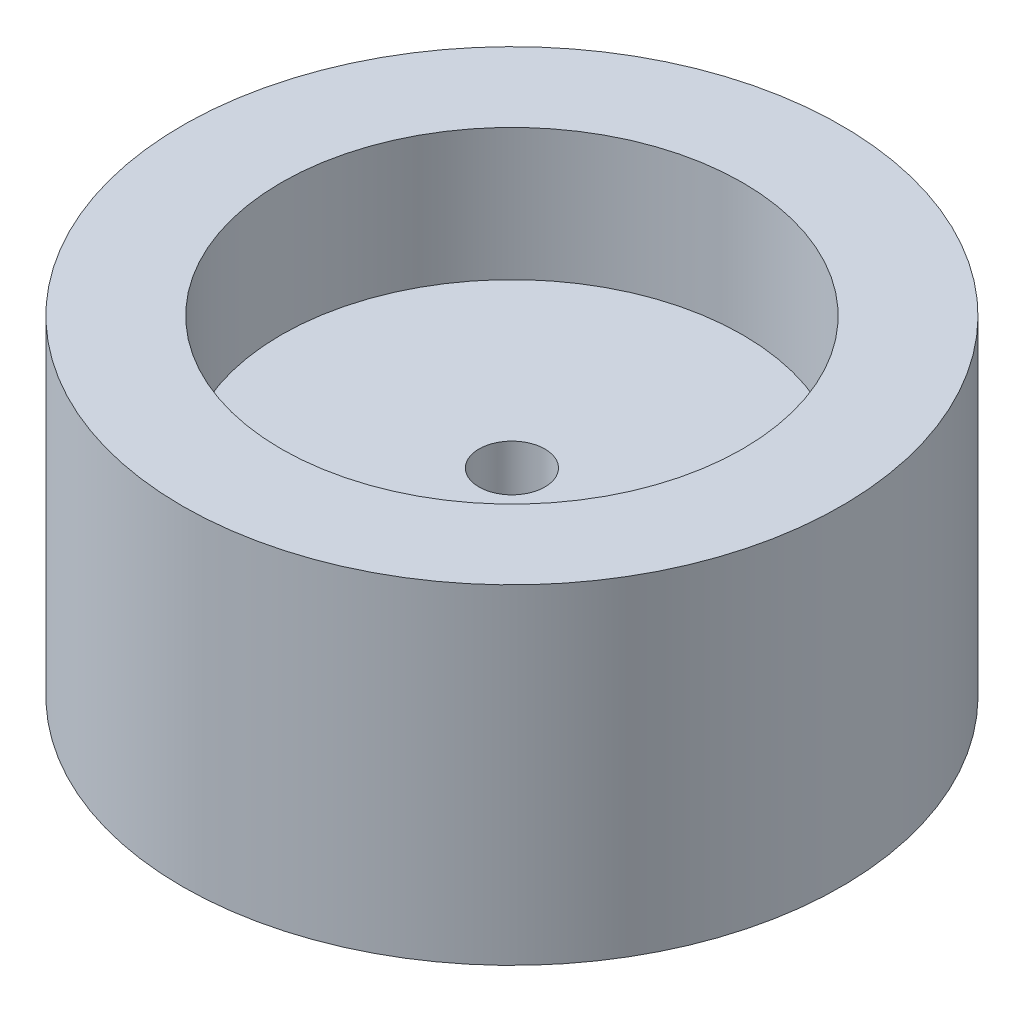
ISO-10303-21;
HEADER;
FILE_DESCRIPTION(('STEP AP214'),'2;1');
FILE_NAME('part.step','',(''),(''),'','','');
FILE_SCHEMA(('AUTOMOTIVE_DESIGN { 1 0 10303 214 1 1 1 1 }'));
ENDSEC;
DATA;
#1=APPLICATION_CONTEXT('core data for automotive mechanical design processes');
#2=APPLICATION_PROTOCOL_DEFINITION('international standard','automotive_design',2000,#1);
#3=PRODUCT_CONTEXT('',#1,'mechanical');
#4=PRODUCT('Part','Part','',(#3));
#5=PRODUCT_RELATED_PRODUCT_CATEGORY('part','',(#4));
#6=PRODUCT_DEFINITION_FORMATION('','',#4);
#7=PRODUCT_DEFINITION_CONTEXT('part definition',#1,'design');
#8=PRODUCT_DEFINITION('design','',#6,#7);
#9=PRODUCT_DEFINITION_SHAPE('','',#8);
#10=(LENGTH_UNIT() NAMED_UNIT(*) SI_UNIT(.MILLI.,.METRE.));
#11=(NAMED_UNIT(*) PLANE_ANGLE_UNIT() SI_UNIT($,.RADIAN.));
#12=(NAMED_UNIT(*) SI_UNIT($,.STERADIAN.) SOLID_ANGLE_UNIT());
#13=UNCERTAINTY_MEASURE_WITH_UNIT(LENGTH_MEASURE(1.E-05),#10,'distance_accuracy_value','');
#14=(GEOMETRIC_REPRESENTATION_CONTEXT(3) GLOBAL_UNCERTAINTY_ASSIGNED_CONTEXT((#13)) GLOBAL_UNIT_ASSIGNED_CONTEXT((#10,
#11,#12)) REPRESENTATION_CONTEXT('',''));
#15=CARTESIAN_POINT('',(0.,0.,0.));
#16=DIRECTION('',(0.,0.,1.));
#17=DIRECTION('',(1.,0.,0.));
#18=AXIS2_PLACEMENT_3D('',#15,#16,#17);
#19=CARTESIAN_POINT('',(0.,25.,0.));
#20=DIRECTION('',(0.,-1.,0.));
#21=DIRECTION('',(0.,0.,-1.));
#22=AXIS2_PLACEMENT_3D('',#19,#20,#21);
#23=CYLINDRICAL_SURFACE('',#22,25.);
#24=CARTESIAN_POINT('',(0.,25.,0.));
#25=DIRECTION('',(0.,1.,0.));
#26=DIRECTION('',(0.,0.,1.));
#27=AXIS2_PLACEMENT_3D('',#24,#25,#26);
#28=CIRCLE('',#27,25.);
#29=CARTESIAN_POINT('',(0.,25.,25.));
#30=VERTEX_POINT('',#29);
#31=EDGE_CURVE('E10',#30,#30,#28,.T.);
#32=ORIENTED_EDGE('',*,*,#31,.F.);
#33=EDGE_LOOP('',(#32));
#34=FACE_BOUND('',#33,.T.);
#35=CARTESIAN_POINT('',(0.,0.,0.));
#36=DIRECTION('',(0.,1.,0.));
#37=DIRECTION('',(0.,0.,1.));
#38=AXIS2_PLACEMENT_3D('',#35,#36,#37);
#39=CIRCLE('',#38,25.);
#40=CARTESIAN_POINT('',(0.,0.,25.));
#41=VERTEX_POINT('',#40);
#42=EDGE_CURVE('E46',#41,#41,#39,.T.);
#43=ORIENTED_EDGE('',*,*,#42,.T.);
#44=EDGE_LOOP('',(#43));
#45=FACE_BOUND('',#44,.T.);
#46=ADVANCED_FACE('F39',(#34,#45),#23,.T.);
#47=CARTESIAN_POINT('',(0.,25.,0.));
#48=DIRECTION('',(0.,1.,0.));
#49=DIRECTION('',(0.,0.,1.));
#50=AXIS2_PLACEMENT_3D('',#47,#48,#49);
#51=PLANE('',#50);
#52=CARTESIAN_POINT('',(0.,25.,0.));
#53=DIRECTION('',(0.,-1.,0.));
#54=DIRECTION('',(0.,0.,-1.));
#55=AXIS2_PLACEMENT_3D('',#52,#53,#54);
#56=CIRCLE('',#55,17.5);
#57=CARTESIAN_POINT('',(0.,25.,-17.5));
#58=VERTEX_POINT('',#57);
#59=EDGE_CURVE('E59',#58,#58,#56,.T.);
#60=ORIENTED_EDGE('',*,*,#59,.T.);
#61=EDGE_LOOP('',(#60));
#62=FACE_BOUND('',#61,.T.);
#63=ORIENTED_EDGE('',*,*,#31,.T.);
#64=EDGE_LOOP('',(#63));
#65=FACE_BOUND('',#64,.T.);
#66=ADVANCED_FACE('F86',(#62,#65),#51,.T.);
#67=CARTESIAN_POINT('',(0.,0.,0.));
#68=DIRECTION('',(0.,1.,0.));
#69=DIRECTION('',(0.,0.,1.));
#70=AXIS2_PLACEMENT_3D('',#67,#68,#69);
#71=PLANE('',#70);
#72=CARTESIAN_POINT('',(0.,0.,0.));
#73=DIRECTION('',(0.,-1.,0.));
#74=DIRECTION('',(0.,0.,-1.));
#75=AXIS2_PLACEMENT_3D('',#72,#73,#74);
#76=CIRCLE('',#75,17.5);
#77=CARTESIAN_POINT('',(0.,0.,-17.5));
#78=VERTEX_POINT('',#77);
#79=EDGE_CURVE('E53',#78,#78,#76,.T.);
#80=ORIENTED_EDGE('',*,*,#79,.F.);
#81=EDGE_LOOP('',(#80));
#82=FACE_BOUND('',#81,.T.);
#83=ORIENTED_EDGE('',*,*,#42,.F.);
#84=EDGE_LOOP('',(#83));
#85=FACE_BOUND('',#84,.T.);
#86=ADVANCED_FACE('F88',(#82,#85),#71,.F.);
#87=CARTESIAN_POINT('',(0.,10.,0.));
#88=DIRECTION('',(0.,-1.,0.));
#89=DIRECTION('',(0.,0.,-1.));
#90=AXIS2_PLACEMENT_3D('',#87,#88,#89);
#91=CYLINDRICAL_SURFACE('',#90,17.5);
#92=CARTESIAN_POINT('',(0.,10.,0.));
#93=DIRECTION('',(0.,-1.,0.));
#94=DIRECTION('',(0.,0.,-1.));
#95=AXIS2_PLACEMENT_3D('',#92,#93,#94);
#96=CIRCLE('',#95,17.5);
#97=CARTESIAN_POINT('',(0.,10.,-17.5));
#98=VERTEX_POINT('',#97);
#99=EDGE_CURVE('E51',#98,#98,#96,.T.);
#100=ORIENTED_EDGE('',*,*,#99,.F.);
#101=EDGE_LOOP('',(#100));
#102=FACE_BOUND('',#101,.T.);
#103=ORIENTED_EDGE('',*,*,#79,.T.);
#104=EDGE_LOOP('',(#103));
#105=FACE_BOUND('',#104,.T.);
#106=ADVANCED_FACE('F94',(#102,#105),#91,.F.);
#107=CARTESIAN_POINT('',(0.,10.,0.));
#108=DIRECTION('',(0.,-1.,0.));
#109=DIRECTION('',(0.,0.,-1.));
#110=AXIS2_PLACEMENT_3D('',#107,#108,#109);
#111=PLANE('',#110);
#112=CARTESIAN_POINT('',(0.,10.,0.));
#113=DIRECTION('',(0.,-1.,0.));
#114=DIRECTION('',(0.,0.,-1.));
#115=AXIS2_PLACEMENT_3D('',#112,#113,#114);
#116=CIRCLE('',#115,2.5);
#117=CARTESIAN_POINT('',(0.,10.,-2.5));
#118=VERTEX_POINT('',#117);
#119=EDGE_CURVE('E64',#118,#118,#116,.T.);
#120=ORIENTED_EDGE('',*,*,#119,.F.);
#121=EDGE_LOOP('',(#120));
#122=FACE_BOUND('',#121,.T.);
#123=ORIENTED_EDGE('',*,*,#99,.T.);
#124=EDGE_LOOP('',(#123));
#125=FACE_BOUND('',#124,.T.);
#126=ADVANCED_FACE('F82',(#122,#125),#111,.T.);
#127=CARTESIAN_POINT('',(0.,15.,0.));
#128=DIRECTION('',(0.,1.,0.));
#129=DIRECTION('',(0.,0.,1.));
#130=AXIS2_PLACEMENT_3D('',#127,#128,#129);
#131=CYLINDRICAL_SURFACE('',#130,17.5);
#132=CARTESIAN_POINT('',(0.,15.,0.));
#133=DIRECTION('',(0.,-1.,0.));
#134=DIRECTION('',(0.,0.,-1.));
#135=AXIS2_PLACEMENT_3D('',#132,#133,#134);
#136=CIRCLE('',#135,17.5);
#137=CARTESIAN_POINT('',(0.,15.,-17.5));
#138=VERTEX_POINT('',#137);
#139=EDGE_CURVE('E56',#138,#138,#136,.T.);
#140=ORIENTED_EDGE('',*,*,#139,.T.);
#141=EDGE_LOOP('',(#140));
#142=FACE_BOUND('',#141,.T.);
#143=ORIENTED_EDGE('',*,*,#59,.F.);
#144=EDGE_LOOP('',(#143));
#145=FACE_BOUND('',#144,.T.);
#146=ADVANCED_FACE('F76',(#142,#145),#131,.F.);
#147=CARTESIAN_POINT('',(0.,15.,0.));
#148=DIRECTION('',(0.,1.,0.));
#149=DIRECTION('',(0.,0.,-1.));
#150=AXIS2_PLACEMENT_3D('',#147,#148,#149);
#151=PLANE('',#150);
#152=CARTESIAN_POINT('',(0.,15.,0.));
#153=DIRECTION('',(0.,1.,0.));
#154=DIRECTION('',(0.,0.,1.));
#155=AXIS2_PLACEMENT_3D('',#152,#153,#154);
#156=CIRCLE('',#155,2.5);
#157=CARTESIAN_POINT('',(0.,15.,-2.5));
#158=VERTEX_POINT('',#157);
#159=EDGE_CURVE('E42',#158,#158,#156,.T.);
#160=ORIENTED_EDGE('',*,*,#159,.F.);
#161=EDGE_LOOP('',(#160));
#162=FACE_BOUND('',#161,.T.);
#163=ORIENTED_EDGE('',*,*,#139,.F.);
#164=EDGE_LOOP('',(#163));
#165=FACE_BOUND('',#164,.T.);
#166=ADVANCED_FACE('F73',(#162,#165),#151,.T.);
#167=CARTESIAN_POINT('',(0.,25.,0.));
#168=DIRECTION('',(0.,-1.,0.));
#169=DIRECTION('',(0.,0.,-1.));
#170=AXIS2_PLACEMENT_3D('',#167,#168,#169);
#171=CYLINDRICAL_SURFACE('',#170,2.5);
#172=CARTESIAN_POINT('',(0.,15.,-2.5));
#173=CARTESIAN_POINT('',(0.,14.9479166666667,-2.5));
#174=CARTESIAN_POINT('',(0.,14.8958333333333,-2.5));
#175=CARTESIAN_POINT('',(0.,14.7916666666667,-2.5));
#176=CARTESIAN_POINT('',(0.,14.7395833333333,-2.5));
#177=CARTESIAN_POINT('',(0.,14.6354166666667,-2.5));
#178=CARTESIAN_POINT('',(0.,14.5833333333333,-2.5));
#179=CARTESIAN_POINT('',(0.,14.4791666666667,-2.5));
#180=CARTESIAN_POINT('',(0.,14.4270833333333,-2.5));
#181=CARTESIAN_POINT('',(0.,14.3229166666667,-2.5));
#182=CARTESIAN_POINT('',(0.,14.2708333333333,-2.5));
#183=CARTESIAN_POINT('',(0.,14.1666666666667,-2.5));
#184=CARTESIAN_POINT('',(0.,14.1145833333333,-2.5));
#185=CARTESIAN_POINT('',(0.,14.0104166666667,-2.5));
#186=CARTESIAN_POINT('',(0.,13.9583333333333,-2.5));
#187=CARTESIAN_POINT('',(0.,13.8541666666667,-2.5));
#188=CARTESIAN_POINT('',(0.,13.8020833333333,-2.5));
#189=CARTESIAN_POINT('',(0.,13.6979166666667,-2.5));
#190=CARTESIAN_POINT('',(0.,13.6458333333333,-2.5));
#191=CARTESIAN_POINT('',(0.,13.5416666666667,-2.5));
#192=CARTESIAN_POINT('',(0.,13.4895833333333,-2.5));
#193=CARTESIAN_POINT('',(0.,13.3854166666667,-2.5));
#194=CARTESIAN_POINT('',(0.,13.3333333333333,-2.5));
#195=CARTESIAN_POINT('',(0.,13.2291666666667,-2.5));
#196=CARTESIAN_POINT('',(0.,13.1770833333333,-2.5));
#197=CARTESIAN_POINT('',(0.,13.0729166666667,-2.5));
#198=CARTESIAN_POINT('',(0.,13.0208333333333,-2.5));
#199=CARTESIAN_POINT('',(0.,12.9166666666667,-2.5));
#200=CARTESIAN_POINT('',(0.,12.8645833333333,-2.5));
#201=CARTESIAN_POINT('',(0.,12.7604166666667,-2.5));
#202=CARTESIAN_POINT('',(0.,12.7083333333333,-2.5));
#203=CARTESIAN_POINT('',(0.,12.6041666666667,-2.5));
#204=CARTESIAN_POINT('',(0.,12.5520833333333,-2.5));
#205=CARTESIAN_POINT('',(0.,12.4479166666667,-2.5));
#206=CARTESIAN_POINT('',(0.,12.3958333333333,-2.5));
#207=CARTESIAN_POINT('',(0.,12.2916666666667,-2.5));
#208=CARTESIAN_POINT('',(0.,12.2395833333333,-2.5));
#209=CARTESIAN_POINT('',(0.,12.1354166666667,-2.5));
#210=CARTESIAN_POINT('',(0.,12.0833333333333,-2.5));
#211=CARTESIAN_POINT('',(0.,11.9791666666667,-2.5));
#212=CARTESIAN_POINT('',(0.,11.9270833333333,-2.5));
#213=CARTESIAN_POINT('',(0.,11.8229166666667,-2.5));
#214=CARTESIAN_POINT('',(0.,11.7708333333333,-2.5));
#215=CARTESIAN_POINT('',(0.,11.6666666666667,-2.5));
#216=CARTESIAN_POINT('',(0.,11.6145833333333,-2.5));
#217=CARTESIAN_POINT('',(0.,11.5104166666667,-2.5));
#218=CARTESIAN_POINT('',(0.,11.4583333333333,-2.5));
#219=CARTESIAN_POINT('',(0.,11.3541666666667,-2.5));
#220=CARTESIAN_POINT('',(0.,11.3020833333333,-2.5));
#221=CARTESIAN_POINT('',(0.,11.1979166666667,-2.5));
#222=CARTESIAN_POINT('',(0.,11.1458333333333,-2.5));
#223=CARTESIAN_POINT('',(0.,11.0416666666667,-2.5));
#224=CARTESIAN_POINT('',(0.,10.9895833333333,-2.5));
#225=CARTESIAN_POINT('',(0.,10.8854166666667,-2.5));
#226=CARTESIAN_POINT('',(0.,10.8333333333333,-2.5));
#227=CARTESIAN_POINT('',(0.,10.7291666666667,-2.5));
#228=CARTESIAN_POINT('',(0.,10.6770833333333,-2.5));
#229=CARTESIAN_POINT('',(0.,10.5729166666667,-2.5));
#230=CARTESIAN_POINT('',(0.,10.5208333333333,-2.5));
#231=CARTESIAN_POINT('',(0.,10.4166666666667,-2.5));
#232=CARTESIAN_POINT('',(0.,10.3645833333333,-2.5));
#233=CARTESIAN_POINT('',(0.,10.2604166666667,-2.5));
#234=CARTESIAN_POINT('',(0.,10.2083333333333,-2.5));
#235=CARTESIAN_POINT('',(0.,10.1041666666667,-2.5));
#236=CARTESIAN_POINT('',(0.,10.0520833333333,-2.5));
#237=CARTESIAN_POINT('',(0.,10.,-2.5));
#238=B_SPLINE_CURVE_WITH_KNOTS('',3,(#172,#173,#174,#175,#176,#177,#178,#179,#180,#181,#182,
#183,#184,#185,#186,#187,#188,#189,#190,#191,#192,#193,#194,#195,#196,#197,#198,#199,#200,#201,
#202,#203,#204,#205,#206,#207,#208,#209,#210,#211,#212,#213,#214,#215,#216,#217,#218,#219,#220,
#221,#222,#223,#224,#225,#226,#227,#228,#229,#230,#231,#232,#233,#234,#235,#236,#237),
.UNSPECIFIED.,.F.,.F.,(4,2,2,2,2,2,2,2,2,2,2,2,2,2,2,2,2,2,2,2,2,2,2,2,2,2,2,2,2,2,2,2,4),(0.,
0.15625,0.3125,0.46875,0.625000000000001,0.781250000000001,0.937500000000001,1.09375,1.25,
1.40625,1.5625,1.71875,1.875,2.03125,2.1875,2.34375,2.5,2.65625,2.8125,2.96875,3.125,3.28125,
3.4375,3.59375,3.75,3.90625,4.0625,4.21875,4.375,4.53125,4.6875,4.84375,5.),.UNSPECIFIED.);
#239=EDGE_CURVE('BSEAM71',#158,#118,#238,.T.);
#240=ORIENTED_EDGE('',*,*,#159,.T.);
#241=ORIENTED_EDGE('',*,*,#119,.T.);
#242=ORIENTED_EDGE('',*,*,#239,.T.);
#243=ORIENTED_EDGE('',*,*,#239,.F.);
#244=EDGE_LOOP('',(#240,#242,#241,#243));
#245=FACE_BOUND('',#244,.T.);
#246=ADVANCED_FACE('F71',(#245),#171,.F.);
#247=CLOSED_SHELL('',(#46,#66,#86,#106,#126,#146,#166,#246));
#248=MANIFOLD_SOLID_BREP('B2',#247);
#249=ADVANCED_BREP_SHAPE_REPRESENTATION('',(#18,#248),#14);
#250=SHAPE_DEFINITION_REPRESENTATION(#9,#249);
ENDSEC;
END-ISO-10303-21;
